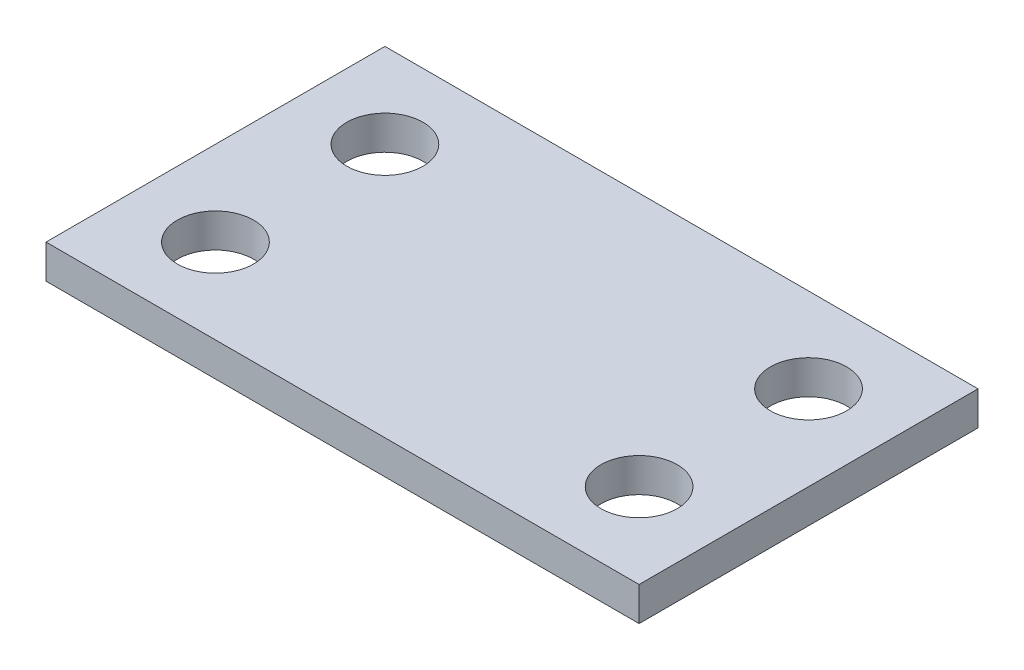
ISO-10303-21;
HEADER;
FILE_DESCRIPTION(('STEP AP214'),'2;1');
FILE_NAME('part.step','',(''),(''),'','','');
FILE_SCHEMA(('AUTOMOTIVE_DESIGN { 1 0 10303 214 1 1 1 1 }'));
ENDSEC;
DATA;
#1=APPLICATION_CONTEXT('core data for automotive mechanical design processes');
#2=APPLICATION_PROTOCOL_DEFINITION('international standard','automotive_design',2000,#1);
#3=PRODUCT_CONTEXT('',#1,'mechanical');
#4=PRODUCT('Part','Part','',(#3));
#5=PRODUCT_RELATED_PRODUCT_CATEGORY('part','',(#4));
#6=PRODUCT_DEFINITION_FORMATION('','',#4);
#7=PRODUCT_DEFINITION_CONTEXT('part definition',#1,'design');
#8=PRODUCT_DEFINITION('design','',#6,#7);
#9=PRODUCT_DEFINITION_SHAPE('','',#8);
#10=(LENGTH_UNIT() NAMED_UNIT(*) SI_UNIT(.MILLI.,.METRE.));
#11=(NAMED_UNIT(*) PLANE_ANGLE_UNIT() SI_UNIT($,.RADIAN.));
#12=(NAMED_UNIT(*) SI_UNIT($,.STERADIAN.) SOLID_ANGLE_UNIT());
#13=UNCERTAINTY_MEASURE_WITH_UNIT(LENGTH_MEASURE(1.E-05),#10,'distance_accuracy_value','');
#14=(GEOMETRIC_REPRESENTATION_CONTEXT(3) GLOBAL_UNCERTAINTY_ASSIGNED_CONTEXT((#13)) GLOBAL_UNIT_ASSIGNED_CONTEXT((#10,
#11,#12)) REPRESENTATION_CONTEXT('',''));
#15=CARTESIAN_POINT('',(0.,0.,0.));
#16=DIRECTION('',(0.,0.,1.));
#17=DIRECTION('',(1.,0.,0.));
#18=AXIS2_PLACEMENT_3D('',#15,#16,#17);
#19=CARTESIAN_POINT('',(0.,8.,0.));
#20=DIRECTION('',(0.,-1.,0.));
#21=DIRECTION('',(0.,0.,-1.));
#22=AXIS2_PLACEMENT_3D('',#19,#20,#21);
#23=PLANE('',#22);
#24=DIRECTION('',(0.,0.,1.));
#25=VECTOR('',#24,1.);
#26=CARTESIAN_POINT('',(0.,8.,0.));
#27=LINE('',#26,#25);
#28=CARTESIAN_POINT('',(0.,8.,-80.));
#29=VERTEX_POINT('',#28);
#30=CARTESIAN_POINT('',(0.,8.,0.));
#31=VERTEX_POINT('',#30);
#32=EDGE_CURVE('E96',#29,#31,#27,.T.);
#33=ORIENTED_EDGE('',*,*,#32,.T.);
#34=DIRECTION('',(1.,0.,0.));
#35=VECTOR('',#34,1.);
#36=CARTESIAN_POINT('',(0.,8.,0.));
#37=LINE('',#36,#35);
#38=CARTESIAN_POINT('',(140.,8.,0.));
#39=VERTEX_POINT('',#38);
#40=EDGE_CURVE('E91',#31,#39,#37,.T.);
#41=ORIENTED_EDGE('',*,*,#40,.T.);
#42=DIRECTION('',(0.,0.,-1.));
#43=VECTOR('',#42,1.);
#44=CARTESIAN_POINT('',(140.,8.,0.));
#45=LINE('',#44,#43);
#46=CARTESIAN_POINT('',(140.,8.,-80.));
#47=VERTEX_POINT('',#46);
#48=EDGE_CURVE('E94',#39,#47,#45,.T.);
#49=ORIENTED_EDGE('',*,*,#48,.T.);
#50=DIRECTION('',(-1.,0.,0.));
#51=VECTOR('',#50,1.);
#52=CARTESIAN_POINT('',(0.,8.,-80.));
#53=LINE('',#52,#51);
#54=EDGE_CURVE('E61',#47,#29,#53,.T.);
#55=ORIENTED_EDGE('',*,*,#54,.T.);
#56=EDGE_LOOP('',(#33,#41,#49,#55));
#57=FACE_BOUND('',#56,.T.);
#58=CARTESIAN_POINT('',(20.,8.,-60.));
#59=DIRECTION('',(0.,1.,0.));
#60=DIRECTION('',(0.,0.,1.));
#61=AXIS2_PLACEMENT_3D('',#58,#59,#60);
#62=CIRCLE('',#61,9.00000000000001);
#63=CARTESIAN_POINT('',(20.,8.,-51.));
#64=VERTEX_POINT('',#63);
#65=EDGE_CURVE('E116',#64,#64,#62,.T.);
#66=ORIENTED_EDGE('',*,*,#65,.F.);
#67=EDGE_LOOP('',(#66));
#68=FACE_BOUND('',#67,.T.);
#69=CARTESIAN_POINT('',(120.,8.,-60.));
#70=DIRECTION('',(0.,1.,0.));
#71=DIRECTION('',(0.,0.,1.));
#72=AXIS2_PLACEMENT_3D('',#69,#70,#71);
#73=CIRCLE('',#72,9.00000000000002);
#74=CARTESIAN_POINT('',(120.,8.,-51.));
#75=VERTEX_POINT('',#74);
#76=EDGE_CURVE('E138',#75,#75,#73,.T.);
#77=ORIENTED_EDGE('',*,*,#76,.F.);
#78=EDGE_LOOP('',(#77));
#79=FACE_BOUND('',#78,.T.);
#80=CARTESIAN_POINT('',(120.,8.,-20.));
#81=DIRECTION('',(0.,1.,0.));
#82=DIRECTION('',(0.,0.,1.));
#83=AXIS2_PLACEMENT_3D('',#80,#81,#82);
#84=CIRCLE('',#83,9.);
#85=CARTESIAN_POINT('',(120.,8.,-11.));
#86=VERTEX_POINT('',#85);
#87=EDGE_CURVE('E146',#86,#86,#84,.T.);
#88=ORIENTED_EDGE('',*,*,#87,.F.);
#89=EDGE_LOOP('',(#88));
#90=FACE_BOUND('',#89,.T.);
#91=CARTESIAN_POINT('',(20.,8.,-20.));
#92=DIRECTION('',(0.,1.,0.));
#93=DIRECTION('',(0.,0.,1.));
#94=AXIS2_PLACEMENT_3D('',#91,#92,#93);
#95=CIRCLE('',#94,9.00000000000001);
#96=CARTESIAN_POINT('',(20.,8.,-11.));
#97=VERTEX_POINT('',#96);
#98=EDGE_CURVE('E154',#97,#97,#95,.T.);
#99=ORIENTED_EDGE('',*,*,#98,.F.);
#100=EDGE_LOOP('',(#99));
#101=FACE_BOUND('',#100,.T.);
#102=ADVANCED_FACE('F43',(#57,#68,#79,#90,#101),#23,.F.);
#103=CARTESIAN_POINT('',(0.,0.,0.));
#104=DIRECTION('',(0.,-1.,0.));
#105=DIRECTION('',(0.,0.,-1.));
#106=AXIS2_PLACEMENT_3D('',#103,#104,#105);
#107=PLANE('',#106);
#108=CARTESIAN_POINT('',(120.,0.,-20.));
#109=DIRECTION('',(0.,1.,0.));
#110=DIRECTION('',(0.,0.,1.));
#111=AXIS2_PLACEMENT_3D('',#108,#109,#110);
#112=CIRCLE('',#111,9.);
#113=CARTESIAN_POINT('',(120.,0.,-11.));
#114=VERTEX_POINT('',#113);
#115=EDGE_CURVE('E150',#114,#114,#112,.T.);
#116=ORIENTED_EDGE('',*,*,#115,.T.);
#117=EDGE_LOOP('',(#116));
#118=FACE_BOUND('',#117,.T.);
#119=CARTESIAN_POINT('',(20.,0.,-60.));
#120=DIRECTION('',(0.,1.,0.));
#121=DIRECTION('',(0.,0.,1.));
#122=AXIS2_PLACEMENT_3D('',#119,#120,#121);
#123=CIRCLE('',#122,9.00000000000001);
#124=CARTESIAN_POINT('',(20.,0.,-51.));
#125=VERTEX_POINT('',#124);
#126=EDGE_CURVE('E134',#125,#125,#123,.T.);
#127=ORIENTED_EDGE('',*,*,#126,.T.);
#128=EDGE_LOOP('',(#127));
#129=FACE_BOUND('',#128,.T.);
#130=DIRECTION('',(0.,0.,1.));
#131=VECTOR('',#130,1.);
#132=CARTESIAN_POINT('',(0.,0.,0.));
#133=LINE('',#132,#131);
#134=CARTESIAN_POINT('',(0.,0.,-80.));
#135=VERTEX_POINT('',#134);
#136=CARTESIAN_POINT('',(0.,0.,0.));
#137=VERTEX_POINT('',#136);
#138=EDGE_CURVE('E112',#135,#137,#133,.T.);
#139=ORIENTED_EDGE('',*,*,#138,.F.);
#140=DIRECTION('',(-1.,0.,0.));
#141=VECTOR('',#140,1.);
#142=CARTESIAN_POINT('',(0.,0.,-80.));
#143=LINE('',#142,#141);
#144=CARTESIAN_POINT('',(140.,0.,-80.));
#145=VERTEX_POINT('',#144);
#146=EDGE_CURVE('E84',#145,#135,#143,.T.);
#147=ORIENTED_EDGE('',*,*,#146,.F.);
#148=DIRECTION('',(0.,0.,-1.));
#149=VECTOR('',#148,1.);
#150=CARTESIAN_POINT('',(140.,0.,0.));
#151=LINE('',#150,#149);
#152=CARTESIAN_POINT('',(140.,0.,0.));
#153=VERTEX_POINT('',#152);
#154=EDGE_CURVE('E78',#153,#145,#151,.T.);
#155=ORIENTED_EDGE('',*,*,#154,.F.);
#156=DIRECTION('',(1.,0.,0.));
#157=VECTOR('',#156,1.);
#158=CARTESIAN_POINT('',(0.,0.,0.));
#159=LINE('',#158,#157);
#160=EDGE_CURVE('E101',#137,#153,#159,.T.);
#161=ORIENTED_EDGE('',*,*,#160,.F.);
#162=EDGE_LOOP('',(#139,#147,#155,#161));
#163=FACE_BOUND('',#162,.T.);
#164=CARTESIAN_POINT('',(120.,0.,-60.));
#165=DIRECTION('',(0.,1.,0.));
#166=DIRECTION('',(0.,0.,1.));
#167=AXIS2_PLACEMENT_3D('',#164,#165,#166);
#168=CIRCLE('',#167,9.00000000000002);
#169=CARTESIAN_POINT('',(120.,0.,-51.));
#170=VERTEX_POINT('',#169);
#171=EDGE_CURVE('E142',#170,#170,#168,.T.);
#172=ORIENTED_EDGE('',*,*,#171,.T.);
#173=EDGE_LOOP('',(#172));
#174=FACE_BOUND('',#173,.T.);
#175=CARTESIAN_POINT('',(20.,0.,-20.));
#176=DIRECTION('',(0.,1.,0.));
#177=DIRECTION('',(0.,0.,1.));
#178=AXIS2_PLACEMENT_3D('',#175,#176,#177);
#179=CIRCLE('',#178,9.00000000000001);
#180=CARTESIAN_POINT('',(20.,0.,-11.));
#181=VERTEX_POINT('',#180);
#182=EDGE_CURVE('E158',#181,#181,#179,.T.);
#183=ORIENTED_EDGE('',*,*,#182,.T.);
#184=EDGE_LOOP('',(#183));
#185=FACE_BOUND('',#184,.T.);
#186=ADVANCED_FACE('F129',(#118,#129,#163,#174,#185),#107,.T.);
#187=CARTESIAN_POINT('',(0.,8.,0.));
#188=DIRECTION('',(1.,0.,0.));
#189=DIRECTION('',(0.,0.,-1.));
#190=AXIS2_PLACEMENT_3D('',#187,#188,#189);
#191=PLANE('',#190);
#192=ORIENTED_EDGE('',*,*,#138,.T.);
#193=DIRECTION('',(0.,-1.,0.));
#194=VECTOR('',#193,1.);
#195=CARTESIAN_POINT('',(0.,8.,0.));
#196=LINE('',#195,#194);
#197=EDGE_CURVE('E11',#31,#137,#196,.T.);
#198=ORIENTED_EDGE('',*,*,#197,.F.);
#199=ORIENTED_EDGE('',*,*,#32,.F.);
#200=DIRECTION('',(0.,-1.,0.));
#201=VECTOR('',#200,1.);
#202=CARTESIAN_POINT('',(0.,8.,-80.));
#203=LINE('',#202,#201);
#204=EDGE_CURVE('E108',#29,#135,#203,.T.);
#205=ORIENTED_EDGE('',*,*,#204,.T.);
#206=EDGE_LOOP('',(#192,#198,#199,#205));
#207=FACE_BOUND('',#206,.T.);
#208=ADVANCED_FACE('F45',(#207),#191,.F.);
#209=CARTESIAN_POINT('',(0.,8.,0.));
#210=DIRECTION('',(0.,0.,-1.));
#211=DIRECTION('',(-1.,0.,0.));
#212=AXIS2_PLACEMENT_3D('',#209,#210,#211);
#213=PLANE('',#212);
#214=ORIENTED_EDGE('',*,*,#160,.T.);
#215=DIRECTION('',(0.,-1.,0.));
#216=VECTOR('',#215,1.);
#217=CARTESIAN_POINT('',(140.,8.,0.));
#218=LINE('',#217,#216);
#219=EDGE_CURVE('E53',#39,#153,#218,.T.);
#220=ORIENTED_EDGE('',*,*,#219,.F.);
#221=ORIENTED_EDGE('',*,*,#40,.F.);
#222=ORIENTED_EDGE('',*,*,#197,.T.);
#223=EDGE_LOOP('',(#214,#220,#221,#222));
#224=FACE_BOUND('',#223,.T.);
#225=ADVANCED_FACE('F100',(#224),#213,.F.);
#226=CARTESIAN_POINT('',(140.,8.,0.));
#227=DIRECTION('',(-1.,0.,0.));
#228=DIRECTION('',(0.,0.,1.));
#229=AXIS2_PLACEMENT_3D('',#226,#227,#228);
#230=PLANE('',#229);
#231=ORIENTED_EDGE('',*,*,#154,.T.);
#232=DIRECTION('',(0.,-1.,0.));
#233=VECTOR('',#232,1.);
#234=CARTESIAN_POINT('',(140.,8.,-80.));
#235=LINE('',#234,#233);
#236=EDGE_CURVE('E103',#47,#145,#235,.T.);
#237=ORIENTED_EDGE('',*,*,#236,.F.);
#238=ORIENTED_EDGE('',*,*,#48,.F.);
#239=ORIENTED_EDGE('',*,*,#219,.T.);
#240=EDGE_LOOP('',(#231,#237,#238,#239));
#241=FACE_BOUND('',#240,.T.);
#242=ADVANCED_FACE('F104',(#241),#230,.F.);
#243=CARTESIAN_POINT('',(0.,8.,-80.));
#244=DIRECTION('',(0.,0.,1.));
#245=DIRECTION('',(1.,0.,0.));
#246=AXIS2_PLACEMENT_3D('',#243,#244,#245);
#247=PLANE('',#246);
#248=ORIENTED_EDGE('',*,*,#146,.T.);
#249=ORIENTED_EDGE('',*,*,#204,.F.);
#250=ORIENTED_EDGE('',*,*,#54,.F.);
#251=ORIENTED_EDGE('',*,*,#236,.T.);
#252=EDGE_LOOP('',(#248,#249,#250,#251));
#253=FACE_BOUND('',#252,.T.);
#254=ADVANCED_FACE('F126',(#253),#247,.F.);
#255=CARTESIAN_POINT('',(20.,8.,-60.));
#256=DIRECTION('',(0.,-1.,0.));
#257=DIRECTION('',(0.,0.,-1.));
#258=AXIS2_PLACEMENT_3D('',#255,#256,#257);
#259=CYLINDRICAL_SURFACE('',#258,9.00000000000001);
#260=ORIENTED_EDGE('',*,*,#65,.T.);
#261=EDGE_LOOP('',(#260));
#262=FACE_BOUND('',#261,.T.);
#263=ORIENTED_EDGE('',*,*,#126,.F.);
#264=EDGE_LOOP('',(#263));
#265=FACE_BOUND('',#264,.T.);
#266=ADVANCED_FACE('F177',(#262,#265),#259,.F.);
#267=CARTESIAN_POINT('',(120.,8.,-60.));
#268=DIRECTION('',(0.,-1.,0.));
#269=DIRECTION('',(0.,0.,-1.));
#270=AXIS2_PLACEMENT_3D('',#267,#268,#269);
#271=CYLINDRICAL_SURFACE('',#270,9.00000000000002);
#272=ORIENTED_EDGE('',*,*,#76,.T.);
#273=EDGE_LOOP('',(#272));
#274=FACE_BOUND('',#273,.T.);
#275=ORIENTED_EDGE('',*,*,#171,.F.);
#276=EDGE_LOOP('',(#275));
#277=FACE_BOUND('',#276,.T.);
#278=ADVANCED_FACE('F231',(#274,#277),#271,.F.);
#279=CARTESIAN_POINT('',(120.,8.,-20.));
#280=DIRECTION('',(0.,-1.,0.));
#281=DIRECTION('',(0.,0.,-1.));
#282=AXIS2_PLACEMENT_3D('',#279,#280,#281);
#283=CYLINDRICAL_SURFACE('',#282,9.);
#284=ORIENTED_EDGE('',*,*,#87,.T.);
#285=EDGE_LOOP('',(#284));
#286=FACE_BOUND('',#285,.T.);
#287=ORIENTED_EDGE('',*,*,#115,.F.);
#288=EDGE_LOOP('',(#287));
#289=FACE_BOUND('',#288,.T.);
#290=ADVANCED_FACE('F240',(#286,#289),#283,.F.);
#291=CARTESIAN_POINT('',(20.,8.,-20.));
#292=DIRECTION('',(0.,-1.,0.));
#293=DIRECTION('',(0.,0.,-1.));
#294=AXIS2_PLACEMENT_3D('',#291,#292,#293);
#295=CYLINDRICAL_SURFACE('',#294,9.00000000000001);
#296=ORIENTED_EDGE('',*,*,#98,.T.);
#297=EDGE_LOOP('',(#296));
#298=FACE_BOUND('',#297,.T.);
#299=ORIENTED_EDGE('',*,*,#182,.F.);
#300=EDGE_LOOP('',(#299));
#301=FACE_BOUND('',#300,.T.);
#302=ADVANCED_FACE('F166',(#298,#301),#295,.F.);
#303=CLOSED_SHELL('',(#102,#186,#208,#225,#242,#254,#266,#278,#290,#302));
#304=MANIFOLD_SOLID_BREP('B2',#303);
#305=ADVANCED_BREP_SHAPE_REPRESENTATION('',(#18,#304),#14);
#306=SHAPE_DEFINITION_REPRESENTATION(#9,#305);
ENDSEC;
END-ISO-10303-21;
